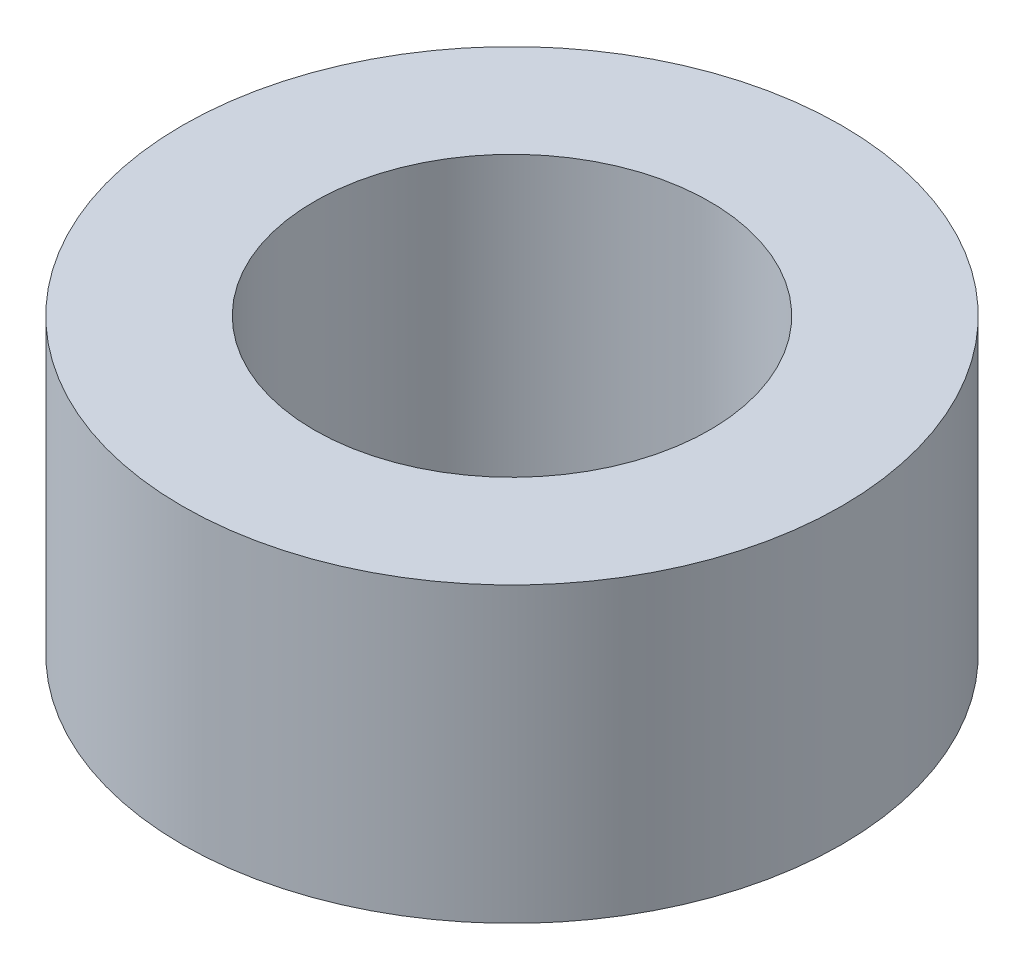
ISO-10303-21;
HEADER;
FILE_DESCRIPTION(('STEP AP214'),'2;1');
FILE_NAME('part.step','',(''),(''),'','','');
FILE_SCHEMA(('AUTOMOTIVE_DESIGN { 1 0 10303 214 1 1 1 1 }'));
ENDSEC;
DATA;
#1=APPLICATION_CONTEXT('core data for automotive mechanical design processes');
#2=APPLICATION_PROTOCOL_DEFINITION('international standard','automotive_design',2000,#1);
#3=PRODUCT_CONTEXT('',#1,'mechanical');
#4=PRODUCT('Part','Part','',(#3));
#5=PRODUCT_RELATED_PRODUCT_CATEGORY('part','',(#4));
#6=PRODUCT_DEFINITION_FORMATION('','',#4);
#7=PRODUCT_DEFINITION_CONTEXT('part definition',#1,'design');
#8=PRODUCT_DEFINITION('design','',#6,#7);
#9=PRODUCT_DEFINITION_SHAPE('','',#8);
#10=(LENGTH_UNIT() NAMED_UNIT(*) SI_UNIT(.MILLI.,.METRE.));
#11=(NAMED_UNIT(*) PLANE_ANGLE_UNIT() SI_UNIT($,.RADIAN.));
#12=(NAMED_UNIT(*) SI_UNIT($,.STERADIAN.) SOLID_ANGLE_UNIT());
#13=UNCERTAINTY_MEASURE_WITH_UNIT(LENGTH_MEASURE(1.E-05),#10,'distance_accuracy_value','');
#14=(GEOMETRIC_REPRESENTATION_CONTEXT(3) GLOBAL_UNCERTAINTY_ASSIGNED_CONTEXT((#13)) GLOBAL_UNIT_ASSIGNED_CONTEXT((#10,
#11,#12)) REPRESENTATION_CONTEXT('',''));
#15=CARTESIAN_POINT('',(0.,0.,0.));
#16=DIRECTION('',(0.,0.,1.));
#17=DIRECTION('',(1.,0.,0.));
#18=AXIS2_PLACEMENT_3D('',#15,#16,#17);
#19=CARTESIAN_POINT('',(0.,2.,0.));
#20=DIRECTION('',(0.,1.,0.));
#21=DIRECTION('',(0.,0.,1.));
#22=AXIS2_PLACEMENT_3D('',#19,#20,#21);
#23=PLANE('',#22);
#24=CARTESIAN_POINT('',(0.,2.,0.));
#25=DIRECTION('',(0.,1.,0.));
#26=DIRECTION('',(0.,0.,1.));
#27=AXIS2_PLACEMENT_3D('',#24,#25,#26);
#28=CIRCLE('',#27,2.25);
#29=CARTESIAN_POINT('',(0.,2.,2.25));
#30=VERTEX_POINT('',#29);
#31=EDGE_CURVE('E10',#30,#30,#28,.T.);
#32=ORIENTED_EDGE('',*,*,#31,.T.);
#33=EDGE_LOOP('',(#32));
#34=FACE_BOUND('',#33,.T.);
#35=CARTESIAN_POINT('',(0.,2.,0.));
#36=DIRECTION('',(0.,1.,0.));
#37=DIRECTION('',(0.,0.,1.));
#38=AXIS2_PLACEMENT_3D('',#35,#36,#37);
#39=CIRCLE('',#38,1.35);
#40=CARTESIAN_POINT('',(0.,2.,1.35));
#41=VERTEX_POINT('',#40);
#42=EDGE_CURVE('E41',#41,#41,#39,.T.);
#43=ORIENTED_EDGE('',*,*,#42,.F.);
#44=EDGE_LOOP('',(#43));
#45=FACE_BOUND('',#44,.T.);
#46=ADVANCED_FACE('F30',(#34,#45),#23,.T.);
#47=CARTESIAN_POINT('',(0.,0.,0.));
#48=DIRECTION('',(0.,1.,0.));
#49=DIRECTION('',(0.,0.,1.));
#50=AXIS2_PLACEMENT_3D('',#47,#48,#49);
#51=PLANE('',#50);
#52=CARTESIAN_POINT('',(0.,0.,0.));
#53=DIRECTION('',(0.,1.,0.));
#54=DIRECTION('',(0.,0.,1.));
#55=AXIS2_PLACEMENT_3D('',#52,#53,#54);
#56=CIRCLE('',#55,2.25);
#57=CARTESIAN_POINT('',(0.,0.,2.25));
#58=VERTEX_POINT('',#57);
#59=EDGE_CURVE('E34',#58,#58,#56,.T.);
#60=ORIENTED_EDGE('',*,*,#59,.F.);
#61=EDGE_LOOP('',(#60));
#62=FACE_BOUND('',#61,.T.);
#63=CARTESIAN_POINT('',(0.,0.,0.));
#64=DIRECTION('',(0.,1.,0.));
#65=DIRECTION('',(0.,0.,1.));
#66=AXIS2_PLACEMENT_3D('',#63,#64,#65);
#67=CIRCLE('',#66,1.35);
#68=CARTESIAN_POINT('',(0.,0.,1.35));
#69=VERTEX_POINT('',#68);
#70=EDGE_CURVE('E43',#69,#69,#67,.T.);
#71=ORIENTED_EDGE('',*,*,#70,.T.);
#72=EDGE_LOOP('',(#71));
#73=FACE_BOUND('',#72,.T.);
#74=ADVANCED_FACE('F53',(#62,#73),#51,.F.);
#75=CARTESIAN_POINT('',(0.,2.,0.));
#76=DIRECTION('',(0.,-1.,0.));
#77=DIRECTION('',(0.,0.,-1.));
#78=AXIS2_PLACEMENT_3D('',#75,#76,#77);
#79=CYLINDRICAL_SURFACE('',#78,2.25);
#80=ORIENTED_EDGE('',*,*,#31,.F.);
#81=EDGE_LOOP('',(#80));
#82=FACE_BOUND('',#81,.T.);
#83=ORIENTED_EDGE('',*,*,#59,.T.);
#84=EDGE_LOOP('',(#83));
#85=FACE_BOUND('',#84,.T.);
#86=ADVANCED_FACE('F32',(#82,#85),#79,.T.);
#87=CARTESIAN_POINT('',(0.,2.,0.));
#88=DIRECTION('',(0.,-1.,0.));
#89=DIRECTION('',(0.,0.,-1.));
#90=AXIS2_PLACEMENT_3D('',#87,#88,#89);
#91=CYLINDRICAL_SURFACE('',#90,1.35);
#92=ORIENTED_EDGE('',*,*,#42,.T.);
#93=EDGE_LOOP('',(#92));
#94=FACE_BOUND('',#93,.T.);
#95=ORIENTED_EDGE('',*,*,#70,.F.);
#96=EDGE_LOOP('',(#95));
#97=FACE_BOUND('',#96,.T.);
#98=ADVANCED_FACE('F49',(#94,#97),#91,.F.);
#99=CLOSED_SHELL('',(#46,#74,#86,#98));
#100=MANIFOLD_SOLID_BREP('B2',#99);
#101=ADVANCED_BREP_SHAPE_REPRESENTATION('',(#18,#100),#14);
#102=SHAPE_DEFINITION_REPRESENTATION(#9,#101);
ENDSEC;
END-ISO-10303-21;
